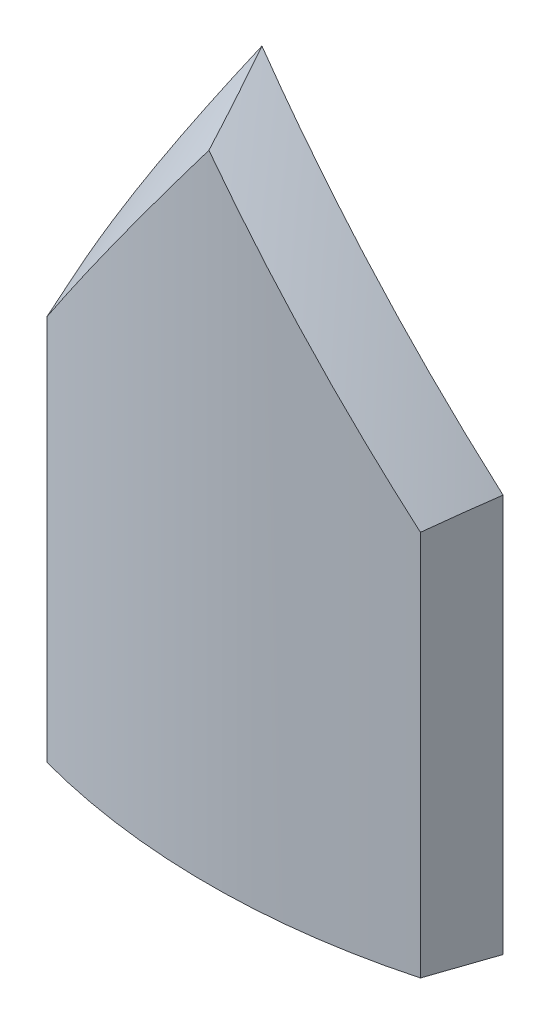
ISO-10303-21;
HEADER;
FILE_DESCRIPTION(('STEP AP214'),'2;1');
FILE_NAME('part.step','',(''),(''),'','','');
FILE_SCHEMA(('AUTOMOTIVE_DESIGN { 1 0 10303 214 1 1 1 1 }'));
ENDSEC;
DATA;
#1=APPLICATION_CONTEXT('core data for automotive mechanical design processes');
#2=APPLICATION_PROTOCOL_DEFINITION('international standard','automotive_design',2000,#1);
#3=PRODUCT_CONTEXT('',#1,'mechanical');
#4=PRODUCT('Part','Part','',(#3));
#5=PRODUCT_RELATED_PRODUCT_CATEGORY('part','',(#4));
#6=PRODUCT_DEFINITION_FORMATION('','',#4);
#7=PRODUCT_DEFINITION_CONTEXT('part definition',#1,'design');
#8=PRODUCT_DEFINITION('design','',#6,#7);
#9=PRODUCT_DEFINITION_SHAPE('','',#8);
#10=(LENGTH_UNIT() NAMED_UNIT(*) SI_UNIT(.MILLI.,.METRE.));
#11=(NAMED_UNIT(*) PLANE_ANGLE_UNIT() SI_UNIT($,.RADIAN.));
#12=(NAMED_UNIT(*) SI_UNIT($,.STERADIAN.) SOLID_ANGLE_UNIT());
#13=UNCERTAINTY_MEASURE_WITH_UNIT(LENGTH_MEASURE(1.E-05),#10,'distance_accuracy_value','');
#14=(GEOMETRIC_REPRESENTATION_CONTEXT(3) GLOBAL_UNCERTAINTY_ASSIGNED_CONTEXT((#13)) GLOBAL_UNIT_ASSIGNED_CONTEXT((#10,
#11,#12)) REPRESENTATION_CONTEXT('',''));
#15=CARTESIAN_POINT('',(0.,0.,0.));
#16=DIRECTION('',(0.,0.,1.));
#17=DIRECTION('',(1.,0.,0.));
#18=AXIS2_PLACEMENT_3D('',#15,#16,#17);
#19=CARTESIAN_POINT('',(0.,0.,0.));
#20=DIRECTION('',(0.,1.,0.));
#21=DIRECTION('',(0.,0.,1.));
#22=AXIS2_PLACEMENT_3D('',#19,#20,#21);
#23=PLANE('',#22);
#24=DIRECTION('',(0.322366917663027,0.,0.946614795149769));
#25=VECTOR('',#24,1.);
#26=CARTESIAN_POINT('',(-17.6107295030016,0.,65.1621992137475));
#27=LINE('',#26,#25);
#28=CARTESIAN_POINT('',(-17.6107295030016,0.,65.1621992137475));
#29=VERTEX_POINT('',#28);
#30=CARTESIAN_POINT('',(-19.5898722829034,0.,59.3505425749381));
#31=VERTEX_POINT('',#30);
#32=EDGE_CURVE('E315',#29,#31,#27,.F.);
#33=ORIENTED_EDGE('',*,*,#32,.T.);
#34=CARTESIAN_POINT('',(0.,0.,0.));
#35=DIRECTION('',(0.,-1.,0.));
#36=DIRECTION('',(0.,0.,-1.));
#37=AXIS2_PLACEMENT_3D('',#34,#35,#36);
#38=CIRCLE('',#37,62.5);
#39=CARTESIAN_POINT('',(19.5898722829034,0.,59.350542574938));
#40=VERTEX_POINT('',#39);
#41=EDGE_CURVE('E305',#40,#31,#38,.T.);
#42=ORIENTED_EDGE('',*,*,#41,.F.);
#43=DIRECTION('',(-0.322366917663025,0.,0.94661479514977));
#44=VECTOR('',#43,1.);
#45=CARTESIAN_POINT('',(17.6107295030016,0.,65.1621992137475));
#46=LINE('',#45,#44);
#47=CARTESIAN_POINT('',(17.6107295030017,0.,65.1621992137474));
#48=VERTEX_POINT('',#47);
#49=EDGE_CURVE('E309',#40,#48,#46,.T.);
#50=ORIENTED_EDGE('',*,*,#49,.T.);
#51=CARTESIAN_POINT('',(0.,0.,0.));
#52=DIRECTION('',(0.,-1.,0.));
#53=DIRECTION('',(0.,0.,-1.));
#54=AXIS2_PLACEMENT_3D('',#51,#52,#53);
#55=CIRCLE('',#54,67.5);
#56=EDGE_CURVE('E403',#29,#48,#55,.F.);
#57=ORIENTED_EDGE('',*,*,#56,.F.);
#58=EDGE_LOOP('',(#33,#42,#50,#57));
#59=FACE_BOUND('',#58,.T.);
#60=ADVANCED_FACE('F254',(#59),#23,.F.);
#61=CARTESIAN_POINT('',(0.,95.,0.));
#62=DIRECTION('',(0.,-1.,0.));
#63=DIRECTION('',(0.,0.,-1.));
#64=AXIS2_PLACEMENT_3D('',#61,#62,#63);
#65=CYLINDRICAL_SURFACE('',#64,67.5);
#66=ORIENTED_EDGE('',*,*,#56,.T.);
#67=DIRECTION('',(0.,-1.,0.));
#68=VECTOR('',#67,1.);
#69=CARTESIAN_POINT('',(17.6107295030017,95.,65.1621992137474));
#70=LINE('',#69,#68);
#71=CARTESIAN_POINT('',(17.610733546955,36.3973221605692,65.1621982288672));
#72=VERTEX_POINT('',#71);
#73=EDGE_CURVE('E320',#48,#72,#70,.F.);
#74=ORIENTED_EDGE('',*,*,#73,.T.);
#75=CARTESIAN_POINT('',(-4.18075355172756,65.4897700079229,67.3704037373958));
#76=CARTESIAN_POINT('',(-2.19721794700526,62.8615238670493,67.4934947796372));
#77=CARTESIAN_POINT('',(-0.208726183611767,60.2342748189229,67.5289431939172));
#78=CARTESIAN_POINT('',(3.76554824855903,54.9769177705115,67.4241931786707));
#79=CARTESIAN_POINT('',(5.74891168189349,52.35031044172,67.2841134349166));
#80=CARTESIAN_POINT('',(8.71122859803484,48.4072496042155,66.9429044650184));
#81=CARTESIAN_POINT('',(9.6958232539744,47.0933356076532,66.8073966123107));
#82=CARTESIAN_POINT('',(11.6579941184097,44.4655905997143,66.4930703172049));
#83=CARTESIAN_POINT('',(12.6355257079843,43.151818492016,66.314261451097));
#84=CARTESIAN_POINT('',(14.5824989999438,40.5232215814678,65.9134933169494));
#85=CARTESIAN_POINT('',(15.5514697445262,39.2090596120852,65.6916199864061));
#86=CARTESIAN_POINT('',(17.4781958919333,36.5812692646406,65.205443341782));
#87=CARTESIAN_POINT('',(18.436256086607,35.2675049190476,64.9410644711362));
#88=CARTESIAN_POINT('',(19.3880106545217,33.9532852021991,64.6556652031371));
#89=B_SPLINE_CURVE_WITH_KNOTS('',3,(#75,#76,#77,#78,#79,#80,#81,#82,#83,#84,#85,#86,#87,#88),
.UNSPECIFIED.,.F.,.F.,(4,2,2,2,2,2,4),(0.0429222502521938,0.0525459411640413,0.0621696320758889,
0.0669814775318127,0.0717933229877365,0.0766051684436602,0.081417013899584),.UNSPECIFIED.);
#90=CARTESIAN_POINT('',(1.00409442587788E-06,59.9575894329974,67.5));
#91=VERTEX_POINT('',#90);
#92=EDGE_CURVE('E402',#72,#91,#89,.F.);
#93=ORIENTED_EDGE('',*,*,#92,.T.);
#94=CARTESIAN_POINT('',(-19.3879855430008,33.9533198797942,64.6556727332134));
#95=CARTESIAN_POINT('',(-18.4362586826709,35.2675011761308,64.941063289802));
#96=CARTESIAN_POINT('',(-17.4782084473742,36.5812519768728,65.2054396373154));
#97=CARTESIAN_POINT('',(-15.5514951689059,39.2090251018269,65.6916141072999));
#98=CARTESIAN_POINT('',(-14.5824852396462,40.5232401790245,65.9134962193769));
#99=CARTESIAN_POINT('',(-12.635550972166,43.1517843631317,66.3142561806866));
#100=CARTESIAN_POINT('',(-11.6580338293561,44.465537261924,66.4930632081143));
#101=CARTESIAN_POINT('',(-9.6958825902519,47.0932563010983,66.80738785468));
#102=CARTESIAN_POINT('',(-8.71129293384399,48.4071638235473,66.9428960937637));
#103=CARTESIAN_POINT('',(-5.74897616592972,52.3502248985447,67.2841079290712));
#104=CARTESIAN_POINT('',(-3.76556938006662,54.9768897998944,67.4241927542833));
#105=CARTESIAN_POINT('',(0.208737065026244,60.2342892304261,67.528943348153));
#106=CARTESIAN_POINT('',(2.19717409940245,62.8614657819517,67.4934972754886));
#107=CARTESIAN_POINT('',(4.180780381731,65.4898055642402,67.3704020724215));
#108=B_SPLINE_CURVE_WITH_KNOTS('',3,(#94,#95,#96,#97,#98,#99,#100,#101,#102,#103,#104,#105,#106,
#107),.UNSPECIFIED.,.F.,.F.,(4,2,2,2,2,2,4),(0.0430552813984924,0.0478671268064096,
0.0526789722143268,0.057490817622244,0.0623026630301613,0.0719263538459957,0.0815500446618301),.UNSPECIFIED.);
#109=CARTESIAN_POINT('',(-17.6107335613535,36.3973220925919,65.1621981880357));
#110=VERTEX_POINT('',#109);
#111=EDGE_CURVE('E397',#91,#110,#108,.F.);
#112=ORIENTED_EDGE('',*,*,#111,.T.);
#113=DIRECTION('',(0.,-1.,0.));
#114=VECTOR('',#113,1.);
#115=CARTESIAN_POINT('',(-17.6107295030016,95.,65.1621992137475));
#116=LINE('',#115,#114);
#117=EDGE_CURVE('E458',#110,#29,#116,.T.);
#118=ORIENTED_EDGE('',*,*,#117,.T.);
#119=EDGE_LOOP('',(#66,#74,#93,#112,#118));
#120=FACE_BOUND('',#119,.T.);
#121=ADVANCED_FACE('F445',(#120),#65,.T.);
#122=CARTESIAN_POINT('',(-17.6107295030016,95.,65.1621992137475));
#123=DIRECTION('',(0.946614795149769,0.,-0.322366917663027));
#124=DIRECTION('',(0.,-1.,0.));
#125=AXIS2_PLACEMENT_3D('',#122,#123,#124);
#126=PLANE('',#125);
#127=ORIENTED_EDGE('',*,*,#32,.F.);
#128=ORIENTED_EDGE('',*,*,#117,.F.);
#129=CARTESIAN_POINT('',(-19.5898722829031,37.5213127395682,59.3505425749388));
#130=CARTESIAN_POINT('',(-19.5110843260933,37.4809080349114,59.5818998291963));
#131=CARTESIAN_POINT('',(-19.4323270415032,37.4399433049742,59.813169488875));
#132=CARTESIAN_POINT('',(-19.2737535260156,37.3563495951134,60.2788204351336));
#133=CARTESIAN_POINT('',(-19.193938146091,37.3137052398279,60.5131992519088));
#134=CARTESIAN_POINT('',(-19.0332474680572,37.2267528786689,60.9850683899096));
#135=CARTESIAN_POINT('',(-18.9523730066531,37.1824299273466,61.2225562407035));
#136=CARTESIAN_POINT('',(-18.7895636425214,37.0921200635169,61.7006434548535));
#137=CARTESIAN_POINT('',(-18.7076295679381,37.0461186066524,61.9412403521049));
#138=CARTESIAN_POINT('',(-18.5427007655013,36.9524516514282,62.4255457301408));
#139=CARTESIAN_POINT('',(-18.4597068608279,36.904771997949,62.669251752749));
#140=CARTESIAN_POINT('',(-18.2926585392816,36.8077484322102,63.1597755369426));
#141=CARTESIAN_POINT('',(-18.2086049446609,36.7583907377637,63.4065908518304));
#142=CARTESIAN_POINT('',(-18.039437702002,36.6580110537581,63.9033334541246));
#143=CARTESIAN_POINT('',(-17.9543248787037,36.60697564362,64.1532583094492));
#144=CARTESIAN_POINT('',(-17.7830400477419,36.5032397654249,64.6562203186313));
#145=CARTESIAN_POINT('',(-17.6968688718204,36.450526215598,64.9092550580542));
#146=CARTESIAN_POINT('',(-17.6107296702289,36.3973276115258,65.1621984895461));
#147=B_SPLINE_CURVE_WITH_KNOTS('',3,(#129,#130,#131,#132,#133,#134,#135,#136,#137,#138,#139,
#140,#141,#142,#143,#144,#145,#146),.UNSPECIFIED.,.F.,.F.,(4,2,2,2,2,2,2,2,4),(0.,
0.743165466782507,1.49688854533836,2.26118407473903,3.03606620829481,3.82154845218263,
4.61764370167016,5.42436427511345,6.24172194589014),.UNSPECIFIED.);
#148=CARTESIAN_POINT('',(-19.5898722829013,37.5213127395714,59.3505425749387));
#149=VERTEX_POINT('',#148);
#150=EDGE_CURVE('E386',#149,#110,#147,.T.);
#151=ORIENTED_EDGE('',*,*,#150,.F.);
#152=DIRECTION('',(0.,-1.,0.));
#153=VECTOR('',#152,1.);
#154=CARTESIAN_POINT('',(-19.5898722829034,18.75,59.3505425749381));
#155=LINE('',#154,#153);
#156=EDGE_CURVE('E308',#31,#149,#155,.F.);
#157=ORIENTED_EDGE('',*,*,#156,.F.);
#158=EDGE_LOOP('',(#127,#128,#151,#157));
#159=FACE_BOUND('',#158,.T.);
#160=ADVANCED_FACE('F256',(#159),#126,.F.);
#161=CARTESIAN_POINT('',(4.180780381731,65.4898055642402,67.3704020724215));
#162=CARTESIAN_POINT('',(2.19717409940245,62.8614657819517,67.4934972754886));
#163=CARTESIAN_POINT('',(0.208737065026244,60.2342892304261,67.528943348153));
#164=CARTESIAN_POINT('',(-3.76556938006662,54.9768897998944,67.4241927542833));
#165=CARTESIAN_POINT('',(-5.74897616592972,52.3502248985447,67.2841079290712));
#166=CARTESIAN_POINT('',(-8.71129293384399,48.4071638235473,66.9428960937637));
#167=CARTESIAN_POINT('',(-9.6958825902519,47.0932563010983,66.80738785468));
#168=CARTESIAN_POINT('',(-11.6580338293561,44.465537261924,66.4930632081143));
#169=CARTESIAN_POINT('',(-12.635550972166,43.1517843631317,66.3142561806866));
#170=CARTESIAN_POINT('',(-14.5824852396462,40.5232401790245,65.9134962193769));
#171=CARTESIAN_POINT('',(-15.5514951689059,39.2090251018269,65.6916141072999));
#172=CARTESIAN_POINT('',(-17.4782084473742,36.5812519768728,65.2054396373154));
#173=CARTESIAN_POINT('',(-18.4362586826709,35.2675011761308,64.941063289802));
#174=CARTESIAN_POINT('',(-19.3879855430008,33.9533198797942,64.6556727332134));
#175=CARTESIAN_POINT('',(1.00234295044823,67.4961496579014,62.4260644277785));
#176=CARTESIAN_POINT('',(-0.835168342913418,64.8685495665401,62.4555976933798));
#177=CARTESIAN_POINT('',(-2.6743028576333,62.2408533932803,62.4039128187994));
#178=CARTESIAN_POINT('',(-6.34185092549699,56.9836888359878,62.1383952057442));
#179=CARTESIAN_POINT('',(-8.16857694649164,54.3569453158766,61.9247521128463));
#180=CARTESIAN_POINT('',(-10.8911972556922,50.4138839634724,61.483711301178));
#181=CARTESIAN_POINT('',(-11.7951835779031,49.0999716735195,61.3167020582925));
#182=CARTESIAN_POINT('',(-13.5948275574169,46.4722372938116,60.9429647602441));
#183=CARTESIAN_POINT('',(-14.4904445355905,45.1584738049047,60.7362471618172));
#184=CARTESIAN_POINT('',(-16.2723593836223,42.5299126378008,60.2832901729752));
#185=CARTESIAN_POINT('',(-17.1582512865617,41.2157417565188,60.03714703795));
#186=CARTESIAN_POINT('',(-18.9179044613067,38.5878755194766,59.5061051580347));
#187=CARTESIAN_POINT('',(-19.7916617579579,37.2744831679398,59.2212462629655));
#188=CARTESIAN_POINT('',(-20.6593654864659,35.9596100176071,58.916962657504));
#189=B_SPLINE_SURFACE_WITH_KNOTS('',1,3,((#161,#162,#163,#164,#165,#166,#167,#168,#169,#170,
#171,#172,#173,#174),(#175,#176,#177,#178,#179,#180,#181,#182,#183,#184,#185,#186,#187,#188)),
.UNSPECIFIED.,.F.,.F.,.F.,(2,2),(4,2,2,2,2,2,4),(0.,1.),(0.0430552813984924,0.0526789722143268,
0.0623026630301613,0.0671145084380785,0.0719263538459957,0.0767381992539129,0.0815500446618301),.UNSPECIFIED.);
#190=CARTESIAN_POINT('',(-4.16248680895582E-09,65.9781584967706,62.5));
#191=CARTESIAN_POINT('',(-9.88486750939574E-08,65.7227090433259,62.6985959336494));
#192=CARTESIAN_POINT('',(-1.27037325040798E-06,65.4680679506445,62.8982313999517));
#193=CARTESIAN_POINT('',(-4.52746082547406E-06,64.9598607904624,63.2999879240672));
#194=CARTESIAN_POINT('',(-6.61499043083292E-06,64.7062982276834,63.502113415317));
#195=CARTESIAN_POINT('',(-1.04575423063302E-05,64.2002500090958,63.9088484458021));
#196=CARTESIAN_POINT('',(-1.2211819281136E-05,63.9477679733384,64.113462488785));
#197=CARTESIAN_POINT('',(-1.4685814221847E-05,63.4438819171586,64.5251727323696));
#198=CARTESIAN_POINT('',(-1.54031809302318E-05,63.1924816315602,64.7322735038226));
#199=CARTESIAN_POINT('',(-1.55215785658204E-05,62.6907597520385,65.1489551479503));
#200=CARTESIAN_POINT('',(-1.49195554040269E-05,62.4404420075728,65.3585406555329));
#201=CARTESIAN_POINT('',(-1.26118448185251E-05,61.9408853786415,65.7801895120918));
#202=CARTESIAN_POINT('',(-1.09035448273851E-05,61.6916504576283,65.9922575566881));
#203=CARTESIAN_POINT('',(-7.05530201666144E-06,61.1942592620088,66.418869065855));
#204=CARTESIAN_POINT('',(-4.91432335848568E-06,60.9461070641887,66.6334172833226));
#205=CARTESIAN_POINT('',(-1.53385863021637E-06,60.4508804532487,67.0649864965191));
#206=CARTESIAN_POINT('',(-2.96617221558896E-07,60.2038102286243,67.2820122986774));
#207=CARTESIAN_POINT('',(-1.86789109644549E-07,59.9575898336351,67.4999977296821));
#208=B_SPLINE_CURVE_WITH_KNOTS('',3,(#190,#191,#192,#193,#194,#195,#196,#197,#198,#199,#200,
#201,#202,#203,#204,#205,#206,#207),.UNSPECIFIED.,.F.,.F.,(4,2,2,2,2,2,2,2,4),(0.,
0.970694231728032,1.94348275860767,2.9184218837484,3.89556829354466,4.87497896468743,
5.85671107457131,6.84082191515856,7.82736881035408),.UNSPECIFIED.);
#209=CARTESIAN_POINT('',(1.63606114506748E-06,65.9781596452033,62.4999972859398));
#210=VERTEX_POINT('',#209);
#211=EDGE_CURVE('E399',#210,#91,#208,.T.);
#212=CARTESIAN_POINT('',(-4.16248695803362E-09,65.9781584967706,62.5));
#213=CARTESIAN_POINT('',(-0.553410646658878,65.1877622296562,62.5000014179669));
#214=CARTESIAN_POINT('',(-1.10683458285629,64.397375304793,62.492648954576));
#215=CARTESIAN_POINT('',(-2.21336571924989,62.8165148135323,62.4632470570092));
#216=CARTESIAN_POINT('',(-2.76647287463694,62.026041247856,62.441195897621));
#217=CARTESIAN_POINT('',(-3.87197146586076,60.4449812192881,62.3824034451972));
#218=CARTESIAN_POINT('',(-4.424362795233,59.6543947555343,62.3456601734358));
#219=CARTESIAN_POINT('',(-5.52788605833095,58.0733651193651,62.2575199729911));
#220=CARTESIAN_POINT('',(-6.07901819481323,57.2829219459958,62.2061255999117));
#221=CARTESIAN_POINT('',(-7.17968888878053,55.7020990744804,62.0887170088204));
#222=CARTESIAN_POINT('',(-7.72922756124433,54.9117193759683,62.0227038736543));
#223=CARTESIAN_POINT('',(-8.82646028197055,53.3308155296521,61.8760888497696));
#224=CARTESIAN_POINT('',(-9.3741539714605,52.5402913820827,61.7954842735734));
#225=CARTESIAN_POINT('',(-10.4672201664414,50.959220881649,61.6197523120765));
#226=CARTESIAN_POINT('',(-11.012592609201,50.1686745287585,61.5246245368175));
#227=CARTESIAN_POINT('',(-12.1005098253926,48.5877341072427,61.3199330902056));
#228=CARTESIAN_POINT('',(-12.6430551279577,47.7973400388918,61.2103722290316));
#229=CARTESIAN_POINT('',(-13.7250544304581,46.2165251738804,60.9768756173498));
#230=CARTESIAN_POINT('',(-14.2645083403466,45.4261043771092,60.852939450326));
#231=CARTESIAN_POINT('',(-15.3400461787712,43.845095820772,60.5907543094361));
#232=CARTESIAN_POINT('',(-15.8761293740522,43.0545080610826,60.452502328332));
#233=CARTESIAN_POINT('',(-16.944360213349,41.4734209511498,60.1618236646354));
#234=CARTESIAN_POINT('',(-17.4765083219404,40.6829216016824,60.0093986851062));
#235=CARTESIAN_POINT('',(-18.5364926105189,39.1020497796685,59.6904906221076));
#236=CARTESIAN_POINT('',(-19.0643294443551,38.3116773063992,59.5240097154735));
#237=CARTESIAN_POINT('',(-19.5898722829013,37.5213127395714,59.3505425749387));
#238=B_SPLINE_CURVE_WITH_KNOTS('',3,(#212,#213,#214,#215,#216,#217,#218,#219,#220,#221,#222,
#223,#224,#225,#226,#227,#228,#229,#230,#231,#232,#233,#234,#235,#236,#237),.UNSPECIFIED.,.F.,
.F.,(4,2,2,2,2,2,2,2,2,2,2,2,4),(0.,2.894606033794,5.78955187248787,8.68488773233499,
11.5797188650324,14.4743356425153,17.3694860991213,20.264714306272,23.1593796318718,
26.0541288496488,28.9494873885702,31.8444984624121,34.7390620067028),.UNSPECIFIED.);
#239=EDGE_CURVE('E15',#149,#210,#238,.F.);
#240=ORIENTED_EDGE('',*,*,#150,.T.);
#241=ORIENTED_EDGE('',*,*,#111,.F.);
#242=ORIENTED_EDGE('',*,*,#211,.F.);
#243=ORIENTED_EDGE('',*,*,#239,.F.);
#244=EDGE_LOOP('',(#240,#241,#242,#243));
#245=FACE_BOUND('',#244,.T.);
#246=ADVANCED_FACE('F348',(#245),#189,.T.);
#247=CARTESIAN_POINT('',(19.3880106545217,33.9532852021991,64.6556652031371));
#248=CARTESIAN_POINT('',(18.436256086607,35.2675049190476,64.9410644711362));
#249=CARTESIAN_POINT('',(17.4781958919333,36.5812692646406,65.205443341782));
#250=CARTESIAN_POINT('',(15.5514697445262,39.2090596120852,65.6916199864061));
#251=CARTESIAN_POINT('',(14.5824989999438,40.5232215814678,65.9134933169494));
#252=CARTESIAN_POINT('',(12.6355257079843,43.151818492016,66.314261451097));
#253=CARTESIAN_POINT('',(11.6579941184097,44.4655905997143,66.4930703172049));
#254=CARTESIAN_POINT('',(9.6958232539744,47.0933356076532,66.8073966123107));
#255=CARTESIAN_POINT('',(8.71122859803484,48.4072496042155,66.9429044650184));
#256=CARTESIAN_POINT('',(5.74891168189349,52.35031044172,67.2841134349166));
#257=CARTESIAN_POINT('',(3.76554824855903,54.9769177705115,67.4241931786707));
#258=CARTESIAN_POINT('',(-0.208726183611767,60.2342748189229,67.5289431939172));
#259=CARTESIAN_POINT('',(-2.19721794700526,62.8615238670493,67.4934947796372));
#260=CARTESIAN_POINT('',(-4.18075355172756,65.4897700079229,67.3704037373958));
#261=CARTESIAN_POINT('',(20.6593883808752,35.9595753219266,58.9169546288947));
#262=CARTESIAN_POINT('',(19.7916594002423,37.2744869250696,59.2212474685603));
#263=CARTESIAN_POINT('',(18.9178930196249,38.5878928042285,59.5061091131325));
#264=CARTESIAN_POINT('',(17.1582280428394,41.2157762696345,60.0371535503275));
#265=CARTESIAN_POINT('',(16.2723719746362,42.5298940401367,60.2832869069583));
#266=CARTESIAN_POINT('',(14.4904214157459,45.1585079339967,60.7362531042341));
#267=CARTESIAN_POINT('',(13.5947911670515,46.4722906320048,60.9429730149435));
#268=CARTESIAN_POINT('',(11.7951291242298,49.1000509804459,61.3167126694028));
#269=CARTESIAN_POINT('',(10.8911381662703,50.4139697443648,61.4837217675157));
#270=CARTESIAN_POINT('',(8.16851759890397,54.3570308586254,61.9247599378167));
#271=CARTESIAN_POINT('',(6.34183142198728,56.9837168016642,62.1383964949581));
#272=CARTESIAN_POINT('',(2.67431290184511,62.2408389866288,62.4039122143815));
#273=CARTESIAN_POINT('',(0.835127736686909,64.8686076318789,62.4555972486582));
#274=CARTESIAN_POINT('',(-1.0023181015683,67.4961141188197,62.4260648273011));
#275=B_SPLINE_SURFACE_WITH_KNOTS('',1,3,((#247,#248,#249,#250,#251,#252,#253,#254,#255,#256,
#257,#258,#259,#260),(#261,#262,#263,#264,#265,#266,#267,#268,#269,#270,#271,#272,#273,#274)),
.UNSPECIFIED.,.F.,.F.,.F.,(2,2),(4,2,2,2,2,2,4),(0.,1.),(0.0429222502521938,0.0477340957081175,
0.0525459411640413,0.0573577866199651,0.0621696320758889,0.0717933229877365,0.081417013899584),.UNSPECIFIED.);
#276=CARTESIAN_POINT('',(17.6107296238725,36.3973277221238,65.1621986453801));
#277=CARTESIAN_POINT('',(17.6968686752298,36.4505262339922,64.9092556551325));
#278=CARTESIAN_POINT('',(17.7830397006873,36.5032396933196,64.6562213572335));
#279=CARTESIAN_POINT('',(17.954324273706,36.6069754202537,64.1532601043203));
#280=CARTESIAN_POINT('',(18.0394369895607,36.6580107691053,63.9033355636446));
#281=CARTESIAN_POINT('',(18.2086040605777,36.7583903587804,63.4065934633397));
#282=CARTESIAN_POINT('',(18.2926575910341,36.8077480196499,63.1597783356963));
#283=CARTESIAN_POINT('',(18.4597058277573,36.9047715449108,62.6692547981254));
#284=CARTESIAN_POINT('',(18.5426997118045,36.9524511909481,62.4255488347997));
#285=CARTESIAN_POINT('',(18.7076285167547,37.0461181563209,61.9412434468765));
#286=CARTESIAN_POINT('',(18.7895626145093,37.0921196302271,61.7006464803599));
#287=CARTESIAN_POINT('',(18.9523720690103,37.1824295514515,61.2225589986112));
#288=CARTESIAN_POINT('',(19.0332465976432,37.2267525425697,60.9850709493893));
#289=CARTESIAN_POINT('',(19.1939374544239,37.3137050048294,60.5132012848181));
#290=CARTESIAN_POINT('',(19.2737529458967,37.3563494208546,60.2788221398068));
#291=CARTESIAN_POINT('',(19.432326729031,37.4399432718199,59.8131704066855));
#292=CARTESIAN_POINT('',(19.5110841697495,37.4809080815482,59.5819002882874));
#293=CARTESIAN_POINT('',(19.5898722829033,37.5213128634182,59.3505425749385));
#294=B_SPLINE_CURVE_WITH_KNOTS('',3,(#276,#277,#278,#279,#280,#281,#282,#283,#284,#285,#286,
#287,#288,#289,#290,#291,#292,#293),.UNSPECIFIED.,.F.,.F.,(4,2,2,2,2,2,2,2,4),(0.,
0.817356245326776,1.62407580454874,2.42017045186805,3.20565250653848,3.98053486480456,
4.74483103390515,5.49855516830399,6.24172210832482),.UNSPECIFIED.);
#295=CARTESIAN_POINT('',(19.5898722829034,37.5213128634153,59.350542574938));
#296=VERTEX_POINT('',#295);
#297=EDGE_CURVE('E278',#296,#72,#294,.F.);
#298=CARTESIAN_POINT('',(19.5898722829014,37.5213128634214,59.3505425749387));
#299=CARTESIAN_POINT('',(19.0643238614513,38.3116857658643,59.5240114137188));
#300=CARTESIAN_POINT('',(18.536481435663,39.1020665741785,59.6904940063488));
#301=CARTESIAN_POINT('',(17.4764961995851,40.6829397039476,60.0094021175999));
#302=CARTESIAN_POINT('',(16.9443528176446,41.4734320260344,60.1618257330435));
#303=CARTESIAN_POINT('',(15.8761226153728,43.0545181809872,60.4525042051385));
#304=CARTESIAN_POINT('',(15.3400352663192,43.84511201297,60.5907571235749));
#305=CARTESIAN_POINT('',(14.2644853037703,45.4261382681817,60.8529448799049));
#306=CARTESIAN_POINT('',(13.7250233990564,46.2165706915298,60.9768826246691));
#307=CARTESIAN_POINT('',(12.6430112466945,47.7974041053572,61.2103812843518));
#308=CARTESIAN_POINT('',(12.100461107587,48.5878050959701,61.3199427013318));
#309=CARTESIAN_POINT('',(11.0125374246582,50.1687546437495,61.5246343617927));
#310=CARTESIAN_POINT('',(10.4671633679441,50.95930320065,61.619761881331));
#311=CARTESIAN_POINT('',(9.37409865145377,52.5403713369627,61.7954926346373));
#312=CARTESIAN_POINT('',(8.8264080744219,53.3308909164094,61.8760963827734));
#313=CARTESIAN_POINT('',(7.72918519067779,54.9117804467284,62.0227093273222));
#314=CARTESIAN_POINT('',(7.17965325548976,55.7021503973577,62.0887213067458));
#315=CARTESIAN_POINT('',(6.0789961153488,57.2829536951301,62.2061278325656));
#316=CARTESIAN_POINT('',(5.52787079555982,58.0733870426386,62.2575212974587));
#317=CARTESIAN_POINT('',(4.42435670384504,59.6544034874494,62.3456604727005));
#318=CARTESIAN_POINT('',(3.87196771966988,60.4449865857514,62.3824035077734));
#319=CARTESIAN_POINT('',(2.76646925085469,62.0260464267875,62.4411957227645));
#320=CARTESIAN_POINT('',(2.21335986613915,62.8165231703308,62.4632467598724));
#321=CARTESIAN_POINT('',(1.10682918805107,64.3973829954283,62.4926484476094));
#322=CARTESIAN_POINT('',(0.5534079428772,65.1877660762069,62.500000953946));
#323=CARTESIAN_POINT('',(-4.16249312443348E-09,65.9781584967706,62.5));
#324=B_SPLINE_CURVE_WITH_KNOTS('',3,(#298,#299,#300,#301,#302,#303,#304,#305,#306,#307,#308,
#309,#310,#311,#312,#313,#314,#315,#316,#317,#318,#319,#320,#321,#322,#323),.UNSPECIFIED.,.F.,
.F.,(4,2,2,2,2,2,2,2,2,2,2,2,4),(0.,2.89459407200117,5.78957941469722,8.68496019575786,
11.5797519969292,14.4744426769837,17.3696789609332,20.2648126881998,23.1593937645682,
26.0541889314073,28.9495124672182,31.8444699407844,34.739061899353),.UNSPECIFIED.);
#325=EDGE_CURVE('E265',#210,#296,#324,.F.);
#326=ORIENTED_EDGE('',*,*,#211,.T.);
#327=ORIENTED_EDGE('',*,*,#92,.F.);
#328=ORIENTED_EDGE('',*,*,#297,.F.);
#329=ORIENTED_EDGE('',*,*,#325,.F.);
#330=EDGE_LOOP('',(#326,#327,#328,#329));
#331=FACE_BOUND('',#330,.T.);
#332=ADVANCED_FACE('F343',(#331),#275,.T.);
#333=CARTESIAN_POINT('',(17.6107295030016,95.,65.1621992137475));
#334=DIRECTION('',(0.94661479514977,0.,0.322366917663025));
#335=DIRECTION('',(0.,-1.,0.));
#336=AXIS2_PLACEMENT_3D('',#333,#334,#335);
#337=PLANE('',#336);
#338=ORIENTED_EDGE('',*,*,#49,.F.);
#339=DIRECTION('',(0.,-1.,0.));
#340=VECTOR('',#339,1.);
#341=CARTESIAN_POINT('',(19.5898722829034,18.75,59.350542574938));
#342=LINE('',#341,#340);
#343=EDGE_CURVE('E302',#296,#40,#342,.T.);
#344=ORIENTED_EDGE('',*,*,#343,.F.);
#345=ORIENTED_EDGE('',*,*,#297,.T.);
#346=ORIENTED_EDGE('',*,*,#73,.F.);
#347=EDGE_LOOP('',(#338,#344,#345,#346));
#348=FACE_BOUND('',#347,.T.);
#349=ADVANCED_FACE('F318',(#348),#337,.T.);
#350=CARTESIAN_POINT('',(0.,110.5,0.));
#351=DIRECTION('',(0.,-1.,0.));
#352=DIRECTION('',(0.,0.,-1.));
#353=AXIS2_PLACEMENT_3D('',#350,#351,#352);
#354=CYLINDRICAL_SURFACE('',#353,62.5);
#355=ORIENTED_EDGE('',*,*,#156,.T.);
#356=ORIENTED_EDGE('',*,*,#239,.T.);
#357=ORIENTED_EDGE('',*,*,#325,.T.);
#358=ORIENTED_EDGE('',*,*,#343,.T.);
#359=ORIENTED_EDGE('',*,*,#41,.T.);
#360=EDGE_LOOP('',(#355,#356,#357,#358,#359));
#361=FACE_BOUND('',#360,.T.);
#362=ADVANCED_FACE('F304',(#361),#354,.F.);
#363=CLOSED_SHELL('',(#60,#121,#160,#246,#332,#349,#362));
#364=MANIFOLD_SOLID_BREP('B2',#363);
#365=ADVANCED_BREP_SHAPE_REPRESENTATION('',(#18,#364),#14);
#366=SHAPE_DEFINITION_REPRESENTATION(#9,#365);
ENDSEC;
END-ISO-10303-21;
